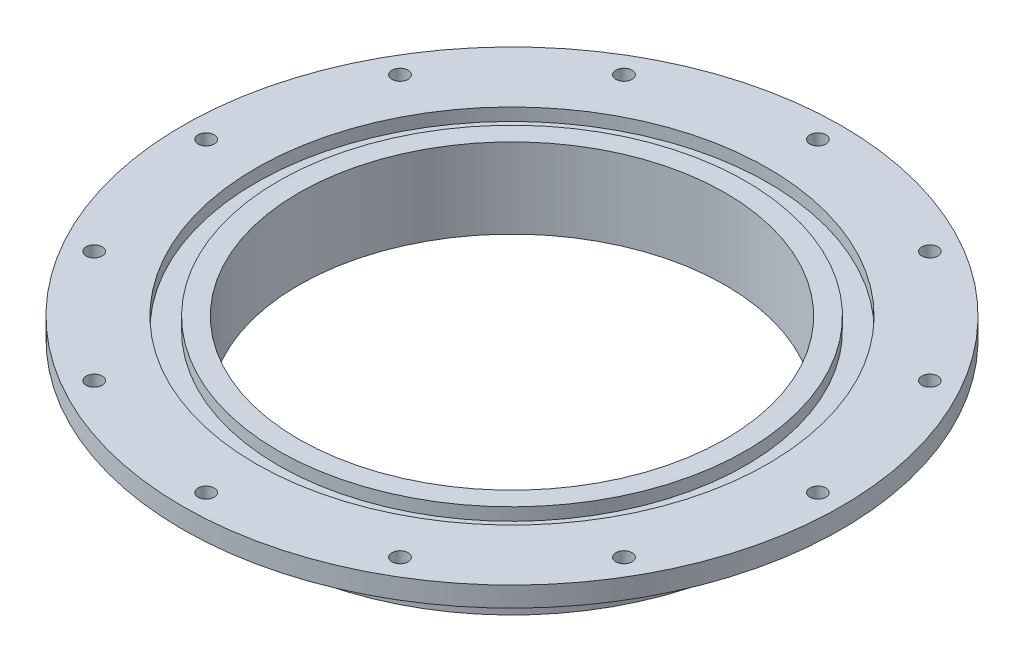
ISO-10303-21;
HEADER;
FILE_DESCRIPTION(('STEP AP214'),'2;1');
FILE_NAME('part.step','',(''),(''),'','','');
FILE_SCHEMA(('AUTOMOTIVE_DESIGN { 1 0 10303 214 1 1 1 1 }'));
ENDSEC;
DATA;
#1=APPLICATION_CONTEXT('core data for automotive mechanical design processes');
#2=APPLICATION_PROTOCOL_DEFINITION('international standard','automotive_design',2000,#1);
#3=PRODUCT_CONTEXT('',#1,'mechanical');
#4=PRODUCT('Part','Part','',(#3));
#5=PRODUCT_RELATED_PRODUCT_CATEGORY('part','',(#4));
#6=PRODUCT_DEFINITION_FORMATION('','',#4);
#7=PRODUCT_DEFINITION_CONTEXT('part definition',#1,'design');
#8=PRODUCT_DEFINITION('design','',#6,#7);
#9=PRODUCT_DEFINITION_SHAPE('','',#8);
#10=(LENGTH_UNIT() NAMED_UNIT(*) SI_UNIT(.MILLI.,.METRE.));
#11=(NAMED_UNIT(*) PLANE_ANGLE_UNIT() SI_UNIT($,.RADIAN.));
#12=(NAMED_UNIT(*) SI_UNIT($,.STERADIAN.) SOLID_ANGLE_UNIT());
#13=UNCERTAINTY_MEASURE_WITH_UNIT(LENGTH_MEASURE(1.E-05),#10,'distance_accuracy_value','');
#14=(GEOMETRIC_REPRESENTATION_CONTEXT(3) GLOBAL_UNCERTAINTY_ASSIGNED_CONTEXT((#13)) GLOBAL_UNIT_ASSIGNED_CONTEXT((#10,
#11,#12)) REPRESENTATION_CONTEXT('',''));
#15=CARTESIAN_POINT('',(0.,0.,0.));
#16=DIRECTION('',(0.,0.,1.));
#17=DIRECTION('',(1.,0.,0.));
#18=AXIS2_PLACEMENT_3D('',#15,#16,#17);
#19=CARTESIAN_POINT('',(0.,25.4,0.));
#20=DIRECTION('',(0.,1.,0.));
#21=DIRECTION('',(0.,0.,1.));
#22=AXIS2_PLACEMENT_3D('',#19,#20,#21);
#23=PLANE('',#22);
#24=CARTESIAN_POINT('',(0.,25.4,0.));
#25=DIRECTION('',(0.,1.,0.));
#26=DIRECTION('',(0.,0.,1.));
#27=AXIS2_PLACEMENT_3D('',#24,#25,#26);
#28=CIRCLE('',#27,67.818);
#29=CARTESIAN_POINT('',(0.,25.4,-67.818));
#30=VERTEX_POINT('',#29);
#31=EDGE_CURVE('E78',#30,#30,#28,.T.);
#32=ORIENTED_EDGE('',*,*,#31,.F.);
#33=EDGE_LOOP('',(#32));
#34=FACE_BOUND('',#33,.T.);
#35=CARTESIAN_POINT('',(0.,25.4,0.));
#36=DIRECTION('',(0.,1.,0.));
#37=DIRECTION('',(0.,0.,1.));
#38=AXIS2_PLACEMENT_3D('',#35,#36,#37);
#39=CIRCLE('',#38,74.295);
#40=CARTESIAN_POINT('',(0.,25.4,74.295));
#41=VERTEX_POINT('',#40);
#42=EDGE_CURVE('E99',#41,#41,#39,.T.);
#43=ORIENTED_EDGE('',*,*,#42,.T.);
#44=EDGE_LOOP('',(#43));
#45=FACE_BOUND('',#44,.T.);
#46=ADVANCED_FACE('F48',(#34,#45),#23,.T.);
#47=CARTESIAN_POINT('',(0.,0.,0.));
#48=DIRECTION('',(0.,1.,0.));
#49=DIRECTION('',(0.,0.,1.));
#50=AXIS2_PLACEMENT_3D('',#47,#48,#49);
#51=PLANE('',#50);
#52=CARTESIAN_POINT('',(0.,0.,0.));
#53=DIRECTION('',(0.,1.,0.));
#54=DIRECTION('',(0.,0.,1.));
#55=AXIS2_PLACEMENT_3D('',#52,#53,#54);
#56=CIRCLE('',#55,80.518);
#57=CARTESIAN_POINT('',(0.,0.,-80.518));
#58=VERTEX_POINT('',#57);
#59=EDGE_CURVE('E52',#58,#58,#56,.T.);
#60=ORIENTED_EDGE('',*,*,#59,.F.);
#61=EDGE_LOOP('',(#60));
#62=FACE_BOUND('',#61,.T.);
#63=CARTESIAN_POINT('',(0.,0.,0.));
#64=DIRECTION('',(0.,1.,0.));
#65=DIRECTION('',(0.,0.,1.));
#66=AXIS2_PLACEMENT_3D('',#63,#64,#65);
#67=CIRCLE('',#66,67.818);
#68=CARTESIAN_POINT('',(0.,0.,-67.818));
#69=VERTEX_POINT('',#68);
#70=EDGE_CURVE('E63',#69,#69,#67,.T.);
#71=ORIENTED_EDGE('',*,*,#70,.T.);
#72=EDGE_LOOP('',(#71));
#73=FACE_BOUND('',#72,.T.);
#74=ADVANCED_FACE('F223',(#62,#73),#51,.F.);
#75=CARTESIAN_POINT('',(0.,19.05,0.));
#76=DIRECTION('',(0.,-1.,0.));
#77=DIRECTION('',(0.,0.,-1.));
#78=AXIS2_PLACEMENT_3D('',#75,#76,#77);
#79=CYLINDRICAL_SURFACE('',#78,80.518);
#80=CARTESIAN_POINT('',(0.,19.05,0.));
#81=DIRECTION('',(0.,1.,0.));
#82=DIRECTION('',(0.,0.,1.));
#83=AXIS2_PLACEMENT_3D('',#80,#81,#82);
#84=CIRCLE('',#83,80.518);
#85=CARTESIAN_POINT('',(0.,19.05,-80.518));
#86=VERTEX_POINT('',#85);
#87=EDGE_CURVE('E11',#86,#86,#84,.T.);
#88=CARTESIAN_POINT('',(0.,19.05,-80.518));
#89=CARTESIAN_POINT('',(0.,18.8515625,-80.518));
#90=CARTESIAN_POINT('',(0.,18.653125,-80.518));
#91=CARTESIAN_POINT('',(0.,18.25625,-80.518));
#92=CARTESIAN_POINT('',(0.,18.0578125,-80.518));
#93=CARTESIAN_POINT('',(0.,17.6609375,-80.518));
#94=CARTESIAN_POINT('',(0.,17.4625,-80.518));
#95=CARTESIAN_POINT('',(0.,17.065625,-80.518));
#96=CARTESIAN_POINT('',(0.,16.8671875,-80.518));
#97=CARTESIAN_POINT('',(0.,16.4703125,-80.518));
#98=CARTESIAN_POINT('',(0.,16.271875,-80.518));
#99=CARTESIAN_POINT('',(0.,15.875,-80.518));
#100=CARTESIAN_POINT('',(0.,15.6765625,-80.518));
#101=CARTESIAN_POINT('',(0.,15.2796875,-80.518));
#102=CARTESIAN_POINT('',(0.,15.08125,-80.518));
#103=CARTESIAN_POINT('',(0.,14.684375,-80.518));
#104=CARTESIAN_POINT('',(0.,14.4859375,-80.518));
#105=CARTESIAN_POINT('',(0.,14.0890625,-80.518));
#106=CARTESIAN_POINT('',(0.,13.890625,-80.518));
#107=CARTESIAN_POINT('',(0.,13.49375,-80.518));
#108=CARTESIAN_POINT('',(0.,13.2953125,-80.518));
#109=CARTESIAN_POINT('',(0.,12.8984375,-80.518));
#110=CARTESIAN_POINT('',(0.,12.7,-80.518));
#111=CARTESIAN_POINT('',(0.,12.303125,-80.518));
#112=CARTESIAN_POINT('',(0.,12.1046875,-80.518));
#113=CARTESIAN_POINT('',(0.,11.7078125,-80.518));
#114=CARTESIAN_POINT('',(0.,11.509375,-80.518));
#115=CARTESIAN_POINT('',(0.,11.1125,-80.518));
#116=CARTESIAN_POINT('',(0.,10.9140625,-80.518));
#117=CARTESIAN_POINT('',(0.,10.5171875,-80.518));
#118=CARTESIAN_POINT('',(0.,10.31875,-80.518));
#119=CARTESIAN_POINT('',(0.,9.921875,-80.518));
#120=CARTESIAN_POINT('',(0.,9.7234375,-80.518));
#121=CARTESIAN_POINT('',(0.,9.3265625,-80.518));
#122=CARTESIAN_POINT('',(0.,9.128125,-80.518));
#123=CARTESIAN_POINT('',(0.,8.73125,-80.518));
#124=CARTESIAN_POINT('',(0.,8.5328125,-80.518));
#125=CARTESIAN_POINT('',(0.,8.1359375,-80.518));
#126=CARTESIAN_POINT('',(0.,7.9375,-80.518));
#127=CARTESIAN_POINT('',(0.,7.540625,-80.518));
#128=CARTESIAN_POINT('',(0.,7.3421875,-80.518));
#129=CARTESIAN_POINT('',(0.,6.9453125,-80.518));
#130=CARTESIAN_POINT('',(0.,6.746875,-80.518));
#131=CARTESIAN_POINT('',(0.,6.35,-80.518));
#132=CARTESIAN_POINT('',(0.,6.1515625,-80.518));
#133=CARTESIAN_POINT('',(0.,5.7546875,-80.518));
#134=CARTESIAN_POINT('',(0.,5.55625,-80.518));
#135=CARTESIAN_POINT('',(0.,5.159375,-80.518));
#136=CARTESIAN_POINT('',(0.,4.9609375,-80.518));
#137=CARTESIAN_POINT('',(0.,4.5640625,-80.518));
#138=CARTESIAN_POINT('',(0.,4.365625,-80.518));
#139=CARTESIAN_POINT('',(0.,3.96875,-80.518));
#140=CARTESIAN_POINT('',(0.,3.7703125,-80.518));
#141=CARTESIAN_POINT('',(0.,3.3734375,-80.518));
#142=CARTESIAN_POINT('',(0.,3.175,-80.518));
#143=CARTESIAN_POINT('',(0.,2.778125,-80.518));
#144=CARTESIAN_POINT('',(0.,2.5796875,-80.518));
#145=CARTESIAN_POINT('',(0.,2.1828125,-80.518));
#146=CARTESIAN_POINT('',(0.,1.984375,-80.518));
#147=CARTESIAN_POINT('',(0.,1.5875,-80.518));
#148=CARTESIAN_POINT('',(0.,1.3890625,-80.518));
#149=CARTESIAN_POINT('',(0.,0.992187500000001,-80.518));
#150=CARTESIAN_POINT('',(0.,0.793750000000001,-80.518));
#151=CARTESIAN_POINT('',(0.,0.396875,-80.518));
#152=CARTESIAN_POINT('',(0.,0.1984375,-80.518));
#153=CARTESIAN_POINT('',(0.,0.,-80.518));
#154=B_SPLINE_CURVE_WITH_KNOTS('',3,(#88,#89,#90,#91,#92,#93,#94,#95,#96,#97,#98,#99,#100,#101,
#102,#103,#104,#105,#106,#107,#108,#109,#110,#111,#112,#113,#114,#115,#116,#117,#118,#119,#120,
#121,#122,#123,#124,#125,#126,#127,#128,#129,#130,#131,#132,#133,#134,#135,#136,#137,#138,#139,
#140,#141,#142,#143,#144,#145,#146,#147,#148,#149,#150,#151,#152,#153),.UNSPECIFIED.,.F.,.F.,(4,
2,2,2,2,2,2,2,2,2,2,2,2,2,2,2,2,2,2,2,2,2,2,2,2,2,2,2,2,2,2,2,4),(0.,0.595312499999997,1.190625,
1.7859375,2.38125,2.9765625,3.571875,4.1671875,4.7625,5.3578125,5.953125,6.5484375,7.14375,
7.7390625,8.334375,8.9296875,9.525,10.1203125,10.715625,11.3109375,11.90625,12.5015625,
13.096875,13.6921875,14.2875,14.8828125,15.478125,16.0734375,16.66875,17.2640625,17.859375,
18.4546875,19.05),.UNSPECIFIED.);
#155=EDGE_CURVE('BSEAM50',#86,#58,#154,.T.);
#156=ORIENTED_EDGE('',*,*,#87,.F.);
#157=ORIENTED_EDGE('',*,*,#59,.T.);
#158=ORIENTED_EDGE('',*,*,#155,.T.);
#159=ORIENTED_EDGE('',*,*,#155,.F.);
#160=EDGE_LOOP('',(#156,#158,#157,#159));
#161=FACE_BOUND('',#160,.T.);
#162=ADVANCED_FACE('F50',(#161),#79,.T.);
#163=CARTESIAN_POINT('',(0.,19.05,0.));
#164=DIRECTION('',(0.,-1.,0.));
#165=DIRECTION('',(0.,0.,-1.));
#166=AXIS2_PLACEMENT_3D('',#163,#164,#165);
#167=CYLINDRICAL_SURFACE('',#166,67.818);
#168=CARTESIAN_POINT('',(0.,0.,-67.818));
#169=CARTESIAN_POINT('',(0.,0.264583333333333,-67.818));
#170=CARTESIAN_POINT('',(0.,0.529166666666666,-67.818));
#171=CARTESIAN_POINT('',(0.,1.05833333333333,-67.818));
#172=CARTESIAN_POINT('',(0.,1.32291666666667,-67.818));
#173=CARTESIAN_POINT('',(0.,1.85208333333333,-67.818));
#174=CARTESIAN_POINT('',(0.,2.11666666666667,-67.818));
#175=CARTESIAN_POINT('',(0.,2.64583333333333,-67.818));
#176=CARTESIAN_POINT('',(0.,2.91041666666667,-67.818));
#177=CARTESIAN_POINT('',(0.,3.43958333333333,-67.818));
#178=CARTESIAN_POINT('',(0.,3.70416666666667,-67.818));
#179=CARTESIAN_POINT('',(0.,4.23333333333333,-67.818));
#180=CARTESIAN_POINT('',(0.,4.49791666666667,-67.818));
#181=CARTESIAN_POINT('',(0.,5.02708333333333,-67.818));
#182=CARTESIAN_POINT('',(0.,5.29166666666666,-67.818));
#183=CARTESIAN_POINT('',(0.,5.82083333333333,-67.818));
#184=CARTESIAN_POINT('',(0.,6.08541666666666,-67.818));
#185=CARTESIAN_POINT('',(0.,6.61458333333333,-67.818));
#186=CARTESIAN_POINT('',(0.,6.87916666666667,-67.818));
#187=CARTESIAN_POINT('',(0.,7.40833333333333,-67.818));
#188=CARTESIAN_POINT('',(0.,7.67291666666667,-67.818));
#189=CARTESIAN_POINT('',(0.,8.20208333333333,-67.818));
#190=CARTESIAN_POINT('',(0.,8.46666666666666,-67.818));
#191=CARTESIAN_POINT('',(0.,8.99583333333333,-67.818));
#192=CARTESIAN_POINT('',(0.,9.26041666666666,-67.818));
#193=CARTESIAN_POINT('',(0.,9.78958333333333,-67.818));
#194=CARTESIAN_POINT('',(0.,10.0541666666667,-67.818));
#195=CARTESIAN_POINT('',(0.,10.5833333333333,-67.818));
#196=CARTESIAN_POINT('',(0.,10.8479166666667,-67.818));
#197=CARTESIAN_POINT('',(0.,11.3770833333333,-67.818));
#198=CARTESIAN_POINT('',(0.,11.6416666666667,-67.818));
#199=CARTESIAN_POINT('',(0.,12.1708333333333,-67.818));
#200=CARTESIAN_POINT('',(0.,12.4354166666667,-67.818));
#201=CARTESIAN_POINT('',(0.,12.9645833333333,-67.818));
#202=CARTESIAN_POINT('',(0.,13.2291666666667,-67.818));
#203=CARTESIAN_POINT('',(0.,13.7583333333333,-67.818));
#204=CARTESIAN_POINT('',(0.,14.0229166666667,-67.818));
#205=CARTESIAN_POINT('',(0.,14.5520833333333,-67.818));
#206=CARTESIAN_POINT('',(0.,14.8166666666667,-67.818));
#207=CARTESIAN_POINT('',(0.,15.3458333333333,-67.818));
#208=CARTESIAN_POINT('',(0.,15.6104166666667,-67.818));
#209=CARTESIAN_POINT('',(0.,16.1395833333333,-67.818));
#210=CARTESIAN_POINT('',(0.,16.4041666666667,-67.818));
#211=CARTESIAN_POINT('',(0.,16.9333333333333,-67.818));
#212=CARTESIAN_POINT('',(0.,17.1979166666667,-67.818));
#213=CARTESIAN_POINT('',(0.,17.7270833333333,-67.818));
#214=CARTESIAN_POINT('',(0.,17.9916666666667,-67.818));
#215=CARTESIAN_POINT('',(0.,18.5208333333333,-67.818));
#216=CARTESIAN_POINT('',(0.,18.7854166666667,-67.818));
#217=CARTESIAN_POINT('',(0.,19.3145833333333,-67.818));
#218=CARTESIAN_POINT('',(0.,19.5791666666667,-67.818));
#219=CARTESIAN_POINT('',(0.,20.1083333333333,-67.818));
#220=CARTESIAN_POINT('',(0.,20.3729166666667,-67.818));
#221=CARTESIAN_POINT('',(0.,20.9020833333333,-67.818));
#222=CARTESIAN_POINT('',(0.,21.1666666666667,-67.818));
#223=CARTESIAN_POINT('',(0.,21.6958333333333,-67.818));
#224=CARTESIAN_POINT('',(0.,21.9604166666667,-67.818));
#225=CARTESIAN_POINT('',(0.,22.4895833333333,-67.818));
#226=CARTESIAN_POINT('',(0.,22.7541666666667,-67.818));
#227=CARTESIAN_POINT('',(0.,23.2833333333333,-67.818));
#228=CARTESIAN_POINT('',(0.,23.5479166666667,-67.818));
#229=CARTESIAN_POINT('',(0.,24.0770833333333,-67.818));
#230=CARTESIAN_POINT('',(0.,24.3416666666667,-67.818));
#231=CARTESIAN_POINT('',(0.,24.8708333333333,-67.818));
#232=CARTESIAN_POINT('',(0.,25.1354166666667,-67.818));
#233=CARTESIAN_POINT('',(0.,25.4,-67.818));
#234=B_SPLINE_CURVE_WITH_KNOTS('',3,(#168,#169,#170,#171,#172,#173,#174,#175,#176,#177,#178,
#179,#180,#181,#182,#183,#184,#185,#186,#187,#188,#189,#190,#191,#192,#193,#194,#195,#196,#197,
#198,#199,#200,#201,#202,#203,#204,#205,#206,#207,#208,#209,#210,#211,#212,#213,#214,#215,#216,
#217,#218,#219,#220,#221,#222,#223,#224,#225,#226,#227,#228,#229,#230,#231,#232,#233),
.UNSPECIFIED.,.F.,.F.,(4,2,2,2,2,2,2,2,2,2,2,2,2,2,2,2,2,2,2,2,2,2,2,2,2,2,2,2,2,2,2,2,4),(0.,
0.793749999999999,1.5875,2.38125,3.175,3.96875,4.7625,5.55625,6.35,7.14375,7.9375,8.73125,9.525,
10.31875,11.1125,11.90625,12.7,13.49375,14.2875,15.08125,15.875,16.66875,17.4625,18.25625,19.05,
19.84375,20.6375,21.43125,22.225,23.01875,23.8125,24.60625,25.4),.UNSPECIFIED.);
#235=EDGE_CURVE('BSEAM195',#69,#30,#234,.T.);
#236=ORIENTED_EDGE('',*,*,#70,.F.);
#237=ORIENTED_EDGE('',*,*,#31,.T.);
#238=ORIENTED_EDGE('',*,*,#235,.T.);
#239=ORIENTED_EDGE('',*,*,#235,.F.);
#240=EDGE_LOOP('',(#236,#238,#237,#239));
#241=FACE_BOUND('',#240,.T.);
#242=ADVANCED_FACE('F195',(#241),#167,.F.);
#243=CARTESIAN_POINT('',(84.2211870243877,25.4,48.6251249999998));
#244=DIRECTION('',(0.,1.,0.));
#245=DIRECTION('',(0.86602540378444,0.,0.499999999999998));
#246=AXIS2_PLACEMENT_3D('',#243,#244,#245);
#247=CIRCLE('',#246,2.55269999999999);
#248=CARTESIAN_POINT('',(86.4318900726283,25.4,49.9014749999998));
#249=VERTEX_POINT('',#248);
#250=EDGE_CURVE('E167',#249,#249,#247,.T.);
#251=ORIENTED_EDGE('',*,*,#250,.F.);
#252=EDGE_LOOP('',(#251));
#253=FACE_BOUND('',#252,.T.);
#254=CARTESIAN_POINT('',(97.25025,25.4,-3.39547433072829E-13));
#255=DIRECTION('',(0.,1.,0.));
#256=DIRECTION('',(1.,0.,0.));
#257=AXIS2_PLACEMENT_3D('',#254,#255,#256);
#258=CIRCLE('',#257,2.55269999999999);
#259=CARTESIAN_POINT('',(99.80295,25.4,-3.48460137486494E-13));
#260=VERTEX_POINT('',#259);
#261=EDGE_CURVE('E160',#260,#260,#258,.T.);
#262=ORIENTED_EDGE('',*,*,#261,.F.);
#263=EDGE_LOOP('',(#262));
#264=FACE_BOUND('',#263,.T.);
#265=CARTESIAN_POINT('',(84.2211870243874,25.4,-48.6251250000004));
#266=DIRECTION('',(0.,1.,0.));
#267=DIRECTION('',(0.866025403784436,0.,-0.500000000000004));
#268=AXIS2_PLACEMENT_3D('',#265,#266,#267);
#269=CIRCLE('',#268,2.55269999999999);
#270=CARTESIAN_POINT('',(86.4318900726279,25.4,-49.9014750000004));
#271=VERTEX_POINT('',#270);
#272=EDGE_CURVE('E153',#271,#271,#269,.T.);
#273=ORIENTED_EDGE('',*,*,#272,.F.);
#274=EDGE_LOOP('',(#273));
#275=FACE_BOUND('',#274,.T.);
#276=CARTESIAN_POINT('',(48.6251249999995,25.4,-84.2211870243879));
#277=DIRECTION('',(0.,1.,0.));
#278=DIRECTION('',(0.499999999999995,0.,-0.866025403784442));
#279=AXIS2_PLACEMENT_3D('',#276,#277,#278);
#280=CIRCLE('',#279,2.55269999999999);
#281=CARTESIAN_POINT('',(49.9014749999995,25.4,-86.4318900726284));
#282=VERTEX_POINT('',#281);
#283=EDGE_CURVE('E146',#282,#282,#280,.T.);
#284=ORIENTED_EDGE('',*,*,#283,.F.);
#285=EDGE_LOOP('',(#284));
#286=FACE_BOUND('',#285,.T.);
#287=CARTESIAN_POINT('',(0.,25.4,-97.25025));
#288=DIRECTION('',(0.,1.,0.));
#289=DIRECTION('',(0.,0.,-1.));
#290=AXIS2_PLACEMENT_3D('',#287,#288,#289);
#291=CIRCLE('',#290,2.55269999999999);
#292=CARTESIAN_POINT('',(0.,25.4,-99.80295));
#293=VERTEX_POINT('',#292);
#294=EDGE_CURVE('E139',#293,#293,#291,.T.);
#295=ORIENTED_EDGE('',*,*,#294,.F.);
#296=EDGE_LOOP('',(#295));
#297=FACE_BOUND('',#296,.T.);
#298=CARTESIAN_POINT('',(-48.6251250000007,25.4,-84.2211870243872));
#299=DIRECTION('',(0.,1.,0.));
#300=DIRECTION('',(-0.500000000000007,0.,-0.866025403784435));
#301=AXIS2_PLACEMENT_3D('',#298,#299,#300);
#302=CIRCLE('',#301,2.55269999999999);
#303=CARTESIAN_POINT('',(-49.9014750000007,25.4,-86.4318900726277));
#304=VERTEX_POINT('',#303);
#305=EDGE_CURVE('E132',#304,#304,#302,.T.);
#306=ORIENTED_EDGE('',*,*,#305,.F.);
#307=EDGE_LOOP('',(#306));
#308=FACE_BOUND('',#307,.T.);
#309=CARTESIAN_POINT('',(-84.2211870243881,25.4,-48.6251249999992));
#310=DIRECTION('',(0.,1.,0.));
#311=DIRECTION('',(-0.866025403784443,0.,-0.499999999999992));
#312=AXIS2_PLACEMENT_3D('',#309,#310,#311);
#313=CIRCLE('',#312,2.55269999999999);
#314=CARTESIAN_POINT('',(-86.4318900726286,25.4,-49.9014749999992));
#315=VERTEX_POINT('',#314);
#316=EDGE_CURVE('E123',#315,#315,#313,.T.);
#317=ORIENTED_EDGE('',*,*,#316,.F.);
#318=EDGE_LOOP('',(#317));
#319=FACE_BOUND('',#318,.T.);
#320=CARTESIAN_POINT('',(-97.25025,25.4,1.01864229921849E-12));
#321=DIRECTION('',(0.,1.,0.));
#322=DIRECTION('',(-1.,0.,0.));
#323=AXIS2_PLACEMENT_3D('',#320,#321,#322);
#324=CIRCLE('',#323,2.55269999999999);
#325=CARTESIAN_POINT('',(-99.80295,25.4,1.04538041245948E-12));
#326=VERTEX_POINT('',#325);
#327=EDGE_CURVE('E124',#326,#326,#324,.T.);
#328=ORIENTED_EDGE('',*,*,#327,.F.);
#329=EDGE_LOOP('',(#328));
#330=FACE_BOUND('',#329,.T.);
#331=CARTESIAN_POINT('',(-84.221187024387,25.4,48.625125000001));
#332=DIRECTION('',(0.,1.,0.));
#333=DIRECTION('',(-0.866025403784433,0.,0.50000000000001));
#334=AXIS2_PLACEMENT_3D('',#331,#332,#333);
#335=CIRCLE('',#334,2.55269999999999);
#336=CARTESIAN_POINT('',(-86.4318900726276,25.4,49.901475000001));
#337=VERTEX_POINT('',#336);
#338=EDGE_CURVE('E179',#337,#337,#335,.T.);
#339=ORIENTED_EDGE('',*,*,#338,.F.);
#340=EDGE_LOOP('',(#339));
#341=FACE_BOUND('',#340,.T.);
#342=CARTESIAN_POINT('',(-48.6251249999989,25.4,84.2211870243882));
#343=DIRECTION('',(0.,1.,0.));
#344=DIRECTION('',(-0.499999999999989,0.,0.866025403784445));
#345=AXIS2_PLACEMENT_3D('',#342,#343,#344);
#346=CIRCLE('',#345,2.55269999999999);
#347=CARTESIAN_POINT('',(-49.9014749999989,25.4,86.4318900726288));
#348=VERTEX_POINT('',#347);
#349=EDGE_CURVE('E180',#348,#348,#346,.T.);
#350=ORIENTED_EDGE('',*,*,#349,.F.);
#351=EDGE_LOOP('',(#350));
#352=FACE_BOUND('',#351,.T.);
#353=CARTESIAN_POINT('',(48.6251250000001,25.4,84.2211870243875));
#354=DIRECTION('',(0.,1.,0.));
#355=DIRECTION('',(0.500000000000001,0.,0.866025403784438));
#356=AXIS2_PLACEMENT_3D('',#353,#354,#355);
#357=CIRCLE('',#356,2.55269999999999);
#358=CARTESIAN_POINT('',(49.9014750000001,25.4,86.4318900726281));
#359=VERTEX_POINT('',#358);
#360=EDGE_CURVE('E115',#359,#359,#357,.T.);
#361=ORIENTED_EDGE('',*,*,#360,.F.);
#362=EDGE_LOOP('',(#361));
#363=FACE_BOUND('',#362,.T.);
#364=CARTESIAN_POINT('',(0.,25.4,97.25025));
#365=DIRECTION('',(0.,1.,0.));
#366=DIRECTION('',(0.,0.,1.));
#367=AXIS2_PLACEMENT_3D('',#364,#365,#366);
#368=CIRCLE('',#367,2.55269999999999);
#369=CARTESIAN_POINT('',(0.,25.4,99.80295));
#370=VERTEX_POINT('',#369);
#371=EDGE_CURVE('E108',#370,#370,#368,.T.);
#372=ORIENTED_EDGE('',*,*,#371,.F.);
#373=EDGE_LOOP('',(#372));
#374=FACE_BOUND('',#373,.T.);
#375=CARTESIAN_POINT('',(0.,25.4,0.));
#376=DIRECTION('',(0.,1.,0.));
#377=DIRECTION('',(0.,0.,1.));
#378=AXIS2_PLACEMENT_3D('',#375,#376,#377);
#379=CIRCLE('',#378,81.407);
#380=CARTESIAN_POINT('',(0.,25.4,81.407));
#381=VERTEX_POINT('',#380);
#382=EDGE_CURVE('E93',#381,#381,#379,.T.);
#383=ORIENTED_EDGE('',*,*,#382,.F.);
#384=EDGE_LOOP('',(#383));
#385=FACE_BOUND('',#384,.T.);
#386=CARTESIAN_POINT('',(0.,25.4,0.));
#387=DIRECTION('',(0.,1.,0.));
#388=DIRECTION('',(0.,0.,1.));
#389=AXIS2_PLACEMENT_3D('',#386,#387,#388);
#390=CIRCLE('',#389,104.775);
#391=CARTESIAN_POINT('',(0.,25.4,104.775));
#392=VERTEX_POINT('',#391);
#393=EDGE_CURVE('E77',#392,#392,#390,.T.);
#394=ORIENTED_EDGE('',*,*,#393,.T.);
#395=EDGE_LOOP('',(#394));
#396=FACE_BOUND('',#395,.T.);
#397=ADVANCED_FACE('F191',(#253,#264,#275,#286,#297,#308,#319,#330,#341,#352,#363,#374,#385,
#396),#23,.T.);
#398=CARTESIAN_POINT('',(0.,19.05,0.));
#399=DIRECTION('',(0.,1.,0.));
#400=DIRECTION('',(0.,0.,1.));
#401=AXIS2_PLACEMENT_3D('',#398,#399,#400);
#402=PLANE('',#401);
#403=CARTESIAN_POINT('',(84.2211870243877,19.05,48.6251249999998));
#404=DIRECTION('',(0.,1.,0.));
#405=DIRECTION('',(0.,0.,1.));
#406=AXIS2_PLACEMENT_3D('',#403,#404,#405);
#407=CIRCLE('',#406,2.55269999999999);
#408=CARTESIAN_POINT('',(84.2211870243877,19.05,51.1778249999998));
#409=VERTEX_POINT('',#408);
#410=EDGE_CURVE('E118',#409,#409,#407,.F.);
#411=ORIENTED_EDGE('',*,*,#410,.F.);
#412=EDGE_LOOP('',(#411));
#413=FACE_BOUND('',#412,.T.);
#414=CARTESIAN_POINT('',(97.25025,19.05,-3.39547433072829E-13));
#415=DIRECTION('',(0.,1.,0.));
#416=DIRECTION('',(0.,0.,1.));
#417=AXIS2_PLACEMENT_3D('',#414,#415,#416);
#418=CIRCLE('',#417,2.55269999999999);
#419=CARTESIAN_POINT('',(97.25025,19.05,2.55269999999965));
#420=VERTEX_POINT('',#419);
#421=EDGE_CURVE('E163',#420,#420,#418,.F.);
#422=ORIENTED_EDGE('',*,*,#421,.F.);
#423=EDGE_LOOP('',(#422));
#424=FACE_BOUND('',#423,.T.);
#425=CARTESIAN_POINT('',(84.2211870243874,19.05,-48.6251250000004));
#426=DIRECTION('',(0.,1.,0.));
#427=DIRECTION('',(0.,0.,1.));
#428=AXIS2_PLACEMENT_3D('',#425,#426,#427);
#429=CIRCLE('',#428,2.55269999999999);
#430=CARTESIAN_POINT('',(84.2211870243874,19.05,-46.0724250000004));
#431=VERTEX_POINT('',#430);
#432=EDGE_CURVE('E156',#431,#431,#429,.F.);
#433=ORIENTED_EDGE('',*,*,#432,.F.);
#434=EDGE_LOOP('',(#433));
#435=FACE_BOUND('',#434,.T.);
#436=CARTESIAN_POINT('',(48.6251249999995,19.05,-84.2211870243879));
#437=DIRECTION('',(0.,1.,0.));
#438=DIRECTION('',(0.,0.,1.));
#439=AXIS2_PLACEMENT_3D('',#436,#437,#438);
#440=CIRCLE('',#439,2.55269999999999);
#441=CARTESIAN_POINT('',(48.6251249999995,19.05,-81.6684870243879));
#442=VERTEX_POINT('',#441);
#443=EDGE_CURVE('E149',#442,#442,#440,.F.);
#444=ORIENTED_EDGE('',*,*,#443,.F.);
#445=EDGE_LOOP('',(#444));
#446=FACE_BOUND('',#445,.T.);
#447=CARTESIAN_POINT('',(0.,19.05,-97.25025));
#448=DIRECTION('',(0.,1.,0.));
#449=DIRECTION('',(0.,0.,1.));
#450=AXIS2_PLACEMENT_3D('',#447,#448,#449);
#451=CIRCLE('',#450,2.55269999999999);
#452=CARTESIAN_POINT('',(0.,19.05,-94.69755));
#453=VERTEX_POINT('',#452);
#454=EDGE_CURVE('E142',#453,#453,#451,.F.);
#455=ORIENTED_EDGE('',*,*,#454,.F.);
#456=EDGE_LOOP('',(#455));
#457=FACE_BOUND('',#456,.T.);
#458=CARTESIAN_POINT('',(-48.6251250000007,19.05,-84.2211870243872));
#459=DIRECTION('',(0.,1.,0.));
#460=DIRECTION('',(0.,0.,1.));
#461=AXIS2_PLACEMENT_3D('',#458,#459,#460);
#462=CIRCLE('',#461,2.55269999999999);
#463=CARTESIAN_POINT('',(-48.6251250000007,19.05,-81.6684870243872));
#464=VERTEX_POINT('',#463);
#465=EDGE_CURVE('E135',#464,#464,#462,.F.);
#466=ORIENTED_EDGE('',*,*,#465,.F.);
#467=EDGE_LOOP('',(#466));
#468=FACE_BOUND('',#467,.T.);
#469=CARTESIAN_POINT('',(-84.2211870243881,19.05,-48.6251249999992));
#470=DIRECTION('',(0.,1.,0.));
#471=DIRECTION('',(0.,0.,1.));
#472=AXIS2_PLACEMENT_3D('',#469,#470,#471);
#473=CIRCLE('',#472,2.55269999999999);
#474=CARTESIAN_POINT('',(-84.2211870243881,19.05,-46.0724249999992));
#475=VERTEX_POINT('',#474);
#476=EDGE_CURVE('E128',#475,#475,#473,.F.);
#477=ORIENTED_EDGE('',*,*,#476,.F.);
#478=EDGE_LOOP('',(#477));
#479=FACE_BOUND('',#478,.T.);
#480=CARTESIAN_POINT('',(-97.25025,19.05,1.01864229921849E-12));
#481=DIRECTION('',(0.,1.,0.));
#482=DIRECTION('',(0.,0.,1.));
#483=AXIS2_PLACEMENT_3D('',#480,#481,#482);
#484=CIRCLE('',#483,2.55269999999999);
#485=CARTESIAN_POINT('',(-97.25025,19.05,2.55270000000101));
#486=VERTEX_POINT('',#485);
#487=EDGE_CURVE('E119',#486,#486,#484,.F.);
#488=ORIENTED_EDGE('',*,*,#487,.F.);
#489=EDGE_LOOP('',(#488));
#490=FACE_BOUND('',#489,.T.);
#491=CARTESIAN_POINT('',(-84.221187024387,19.05,48.625125000001));
#492=DIRECTION('',(0.,1.,0.));
#493=DIRECTION('',(0.,0.,1.));
#494=AXIS2_PLACEMENT_3D('',#491,#492,#493);
#495=CIRCLE('',#494,2.55269999999999);
#496=CARTESIAN_POINT('',(-84.221187024387,19.05,51.177825000001));
#497=VERTEX_POINT('',#496);
#498=EDGE_CURVE('E127',#497,#497,#495,.F.);
#499=ORIENTED_EDGE('',*,*,#498,.F.);
#500=EDGE_LOOP('',(#499));
#501=FACE_BOUND('',#500,.T.);
#502=CARTESIAN_POINT('',(-48.6251249999989,19.05,84.2211870243882));
#503=DIRECTION('',(0.,1.,0.));
#504=DIRECTION('',(0.,0.,1.));
#505=AXIS2_PLACEMENT_3D('',#502,#503,#504);
#506=CIRCLE('',#505,2.55269999999999);
#507=CARTESIAN_POINT('',(-48.6251249999989,19.05,86.7738870243882));
#508=VERTEX_POINT('',#507);
#509=EDGE_CURVE('E175',#508,#508,#506,.F.);
#510=ORIENTED_EDGE('',*,*,#509,.F.);
#511=EDGE_LOOP('',(#510));
#512=FACE_BOUND('',#511,.T.);
#513=CARTESIAN_POINT('',(48.6251250000001,19.05,84.2211870243875));
#514=DIRECTION('',(0.,1.,0.));
#515=DIRECTION('',(0.,0.,1.));
#516=AXIS2_PLACEMENT_3D('',#513,#514,#515);
#517=CIRCLE('',#516,2.55269999999999);
#518=CARTESIAN_POINT('',(48.6251250000001,19.05,86.7738870243875));
#519=VERTEX_POINT('',#518);
#520=EDGE_CURVE('E111',#519,#519,#517,.F.);
#521=ORIENTED_EDGE('',*,*,#520,.F.);
#522=EDGE_LOOP('',(#521));
#523=FACE_BOUND('',#522,.T.);
#524=CARTESIAN_POINT('',(0.,19.05,97.25025));
#525=DIRECTION('',(0.,1.,0.));
#526=DIRECTION('',(0.,0.,1.));
#527=AXIS2_PLACEMENT_3D('',#524,#525,#526);
#528=CIRCLE('',#527,2.55269999999999);
#529=CARTESIAN_POINT('',(0.,19.05,99.80295));
#530=VERTEX_POINT('',#529);
#531=EDGE_CURVE('E102',#530,#530,#528,.F.);
#532=ORIENTED_EDGE('',*,*,#531,.F.);
#533=EDGE_LOOP('',(#532));
#534=FACE_BOUND('',#533,.T.);
#535=ORIENTED_EDGE('',*,*,#87,.T.);
#536=EDGE_LOOP('',(#535));
#537=FACE_BOUND('',#536,.T.);
#538=CARTESIAN_POINT('',(0.,19.05,0.));
#539=DIRECTION('',(0.,1.,0.));
#540=DIRECTION('',(0.,0.,1.));
#541=AXIS2_PLACEMENT_3D('',#538,#539,#540);
#542=CIRCLE('',#541,104.775);
#543=CARTESIAN_POINT('',(0.,19.05,104.775));
#544=VERTEX_POINT('',#543);
#545=EDGE_CURVE('E74',#544,#544,#542,.T.);
#546=ORIENTED_EDGE('',*,*,#545,.F.);
#547=EDGE_LOOP('',(#546));
#548=FACE_BOUND('',#547,.T.);
#549=ADVANCED_FACE('F194',(#413,#424,#435,#446,#457,#468,#479,#490,#501,#512,#523,#534,#537,
#548),#402,.F.);
#550=CARTESIAN_POINT('',(0.,25.4,0.));
#551=DIRECTION('',(0.,-1.,0.));
#552=DIRECTION('',(0.,0.,-1.));
#553=AXIS2_PLACEMENT_3D('',#550,#551,#552);
#554=CYLINDRICAL_SURFACE('',#553,104.775);
#555=ORIENTED_EDGE('',*,*,#393,.F.);
#556=EDGE_LOOP('',(#555));
#557=FACE_BOUND('',#556,.T.);
#558=ORIENTED_EDGE('',*,*,#545,.T.);
#559=EDGE_LOOP('',(#558));
#560=FACE_BOUND('',#559,.T.);
#561=ADVANCED_FACE('F208',(#557,#560),#554,.T.);
#562=CARTESIAN_POINT('',(0.,21.4122,0.));
#563=DIRECTION('',(0.,1.,0.));
#564=DIRECTION('',(0.,0.,1.));
#565=AXIS2_PLACEMENT_3D('',#562,#563,#564);
#566=CYLINDRICAL_SURFACE('',#565,81.407);
#567=CARTESIAN_POINT('',(0.,21.4122,0.));
#568=DIRECTION('',(0.,1.,0.));
#569=DIRECTION('',(0.,0.,1.));
#570=AXIS2_PLACEMENT_3D('',#567,#568,#569);
#571=CIRCLE('',#570,81.407);
#572=CARTESIAN_POINT('',(0.,21.4122,81.407));
#573=VERTEX_POINT('',#572);
#574=EDGE_CURVE('E92',#573,#573,#571,.T.);
#575=ORIENTED_EDGE('',*,*,#574,.F.);
#576=EDGE_LOOP('',(#575));
#577=FACE_BOUND('',#576,.T.);
#578=ORIENTED_EDGE('',*,*,#382,.T.);
#579=EDGE_LOOP('',(#578));
#580=FACE_BOUND('',#579,.T.);
#581=ADVANCED_FACE('F211',(#577,#580),#566,.F.);
#582=CARTESIAN_POINT('',(0.,21.4122,0.));
#583=DIRECTION('',(0.,1.,0.));
#584=DIRECTION('',(0.,0.,1.));
#585=AXIS2_PLACEMENT_3D('',#582,#583,#584);
#586=PLANE('',#585);
#587=CARTESIAN_POINT('',(0.,21.4122,0.));
#588=DIRECTION('',(0.,1.,0.));
#589=DIRECTION('',(0.,0.,1.));
#590=AXIS2_PLACEMENT_3D('',#587,#588,#589);
#591=CIRCLE('',#590,74.295);
#592=CARTESIAN_POINT('',(0.,21.4122,74.295));
#593=VERTEX_POINT('',#592);
#594=EDGE_CURVE('E96',#593,#593,#591,.T.);
#595=ORIENTED_EDGE('',*,*,#594,.F.);
#596=EDGE_LOOP('',(#595));
#597=FACE_BOUND('',#596,.T.);
#598=ORIENTED_EDGE('',*,*,#574,.T.);
#599=EDGE_LOOP('',(#598));
#600=FACE_BOUND('',#599,.T.);
#601=ADVANCED_FACE('F234',(#597,#600),#586,.T.);
#602=CARTESIAN_POINT('',(0.,21.4122,0.));
#603=DIRECTION('',(0.,1.,0.));
#604=DIRECTION('',(0.,0.,1.));
#605=AXIS2_PLACEMENT_3D('',#602,#603,#604);
#606=CYLINDRICAL_SURFACE('',#605,74.295);
#607=ORIENTED_EDGE('',*,*,#594,.T.);
#608=EDGE_LOOP('',(#607));
#609=FACE_BOUND('',#608,.T.);
#610=ORIENTED_EDGE('',*,*,#42,.F.);
#611=EDGE_LOOP('',(#610));
#612=FACE_BOUND('',#611,.T.);
#613=ADVANCED_FACE('F238',(#609,#612),#606,.T.);
#614=CARTESIAN_POINT('',(0.,11.8298740786604,97.25025));
#615=DIRECTION('',(0.,1.,0.));
#616=DIRECTION('',(0.,0.,1.));
#617=AXIS2_PLACEMENT_3D('',#614,#615,#616);
#618=CYLINDRICAL_SURFACE('',#617,2.55269999999999);
#619=ORIENTED_EDGE('',*,*,#531,.T.);
#620=EDGE_LOOP('',(#619));
#621=FACE_BOUND('',#620,.T.);
#622=ORIENTED_EDGE('',*,*,#371,.T.);
#623=EDGE_LOOP('',(#622));
#624=FACE_BOUND('',#623,.T.);
#625=ADVANCED_FACE('F242',(#621,#624),#618,.F.);
#626=CARTESIAN_POINT('',(48.6251250000001,11.8298740786604,84.2211870243875));
#627=DIRECTION('',(0.,1.,0.));
#628=DIRECTION('',(0.,0.,1.));
#629=AXIS2_PLACEMENT_3D('',#626,#627,#628);
#630=CYLINDRICAL_SURFACE('',#629,2.55269999999999);
#631=ORIENTED_EDGE('',*,*,#520,.T.);
#632=EDGE_LOOP('',(#631));
#633=FACE_BOUND('',#632,.T.);
#634=ORIENTED_EDGE('',*,*,#360,.T.);
#635=EDGE_LOOP('',(#634));
#636=FACE_BOUND('',#635,.T.);
#637=ADVANCED_FACE('F246',(#633,#636),#630,.F.);
#638=CARTESIAN_POINT('',(-48.6251249999989,11.8298740786604,84.2211870243882));
#639=DIRECTION('',(0.,1.,0.));
#640=DIRECTION('',(0.,0.,1.));
#641=AXIS2_PLACEMENT_3D('',#638,#639,#640);
#642=CYLINDRICAL_SURFACE('',#641,2.55269999999999);
#643=ORIENTED_EDGE('',*,*,#509,.T.);
#644=EDGE_LOOP('',(#643));
#645=FACE_BOUND('',#644,.T.);
#646=ORIENTED_EDGE('',*,*,#349,.T.);
#647=EDGE_LOOP('',(#646));
#648=FACE_BOUND('',#647,.T.);
#649=ADVANCED_FACE('F250',(#645,#648),#642,.F.);
#650=CARTESIAN_POINT('',(-84.221187024387,11.8298740786604,48.625125000001));
#651=DIRECTION('',(0.,1.,0.));
#652=DIRECTION('',(0.,0.,1.));
#653=AXIS2_PLACEMENT_3D('',#650,#651,#652);
#654=CYLINDRICAL_SURFACE('',#653,2.55269999999999);
#655=ORIENTED_EDGE('',*,*,#498,.T.);
#656=EDGE_LOOP('',(#655));
#657=FACE_BOUND('',#656,.T.);
#658=ORIENTED_EDGE('',*,*,#338,.T.);
#659=EDGE_LOOP('',(#658));
#660=FACE_BOUND('',#659,.T.);
#661=ADVANCED_FACE('F189',(#657,#660),#654,.F.);
#662=CARTESIAN_POINT('',(-97.25025,11.8298740786604,1.01864229921849E-12));
#663=DIRECTION('',(0.,1.,0.));
#664=DIRECTION('',(0.,0.,1.));
#665=AXIS2_PLACEMENT_3D('',#662,#663,#664);
#666=CYLINDRICAL_SURFACE('',#665,2.55269999999999);
#667=ORIENTED_EDGE('',*,*,#487,.T.);
#668=EDGE_LOOP('',(#667));
#669=FACE_BOUND('',#668,.T.);
#670=ORIENTED_EDGE('',*,*,#327,.T.);
#671=EDGE_LOOP('',(#670));
#672=FACE_BOUND('',#671,.T.);
#673=ADVANCED_FACE('F252',(#669,#672),#666,.F.);
#674=CARTESIAN_POINT('',(-84.2211870243881,11.8298740786604,-48.6251249999992));
#675=DIRECTION('',(0.,1.,0.));
#676=DIRECTION('',(0.,0.,1.));
#677=AXIS2_PLACEMENT_3D('',#674,#675,#676);
#678=CYLINDRICAL_SURFACE('',#677,2.55269999999999);
#679=ORIENTED_EDGE('',*,*,#476,.T.);
#680=EDGE_LOOP('',(#679));
#681=FACE_BOUND('',#680,.T.);
#682=ORIENTED_EDGE('',*,*,#316,.T.);
#683=EDGE_LOOP('',(#682));
#684=FACE_BOUND('',#683,.T.);
#685=ADVANCED_FACE('F255',(#681,#684),#678,.F.);
#686=CARTESIAN_POINT('',(-48.6251250000007,11.8298740786604,-84.2211870243872));
#687=DIRECTION('',(0.,1.,0.));
#688=DIRECTION('',(0.,0.,1.));
#689=AXIS2_PLACEMENT_3D('',#686,#687,#688);
#690=CYLINDRICAL_SURFACE('',#689,2.55269999999999);
#691=ORIENTED_EDGE('',*,*,#465,.T.);
#692=EDGE_LOOP('',(#691));
#693=FACE_BOUND('',#692,.T.);
#694=ORIENTED_EDGE('',*,*,#305,.T.);
#695=EDGE_LOOP('',(#694));
#696=FACE_BOUND('',#695,.T.);
#697=ADVANCED_FACE('F259',(#693,#696),#690,.F.);
#698=CARTESIAN_POINT('',(0.,11.8298740786604,-97.25025));
#699=DIRECTION('',(0.,1.,0.));
#700=DIRECTION('',(0.,0.,1.));
#701=AXIS2_PLACEMENT_3D('',#698,#699,#700);
#702=CYLINDRICAL_SURFACE('',#701,2.55269999999999);
#703=ORIENTED_EDGE('',*,*,#454,.T.);
#704=EDGE_LOOP('',(#703));
#705=FACE_BOUND('',#704,.T.);
#706=ORIENTED_EDGE('',*,*,#294,.T.);
#707=EDGE_LOOP('',(#706));
#708=FACE_BOUND('',#707,.T.);
#709=ADVANCED_FACE('F263',(#705,#708),#702,.F.);
#710=CARTESIAN_POINT('',(48.6251249999995,11.8298740786604,-84.2211870243879));
#711=DIRECTION('',(0.,1.,0.));
#712=DIRECTION('',(0.,0.,1.));
#713=AXIS2_PLACEMENT_3D('',#710,#711,#712);
#714=CYLINDRICAL_SURFACE('',#713,2.55269999999999);
#715=ORIENTED_EDGE('',*,*,#443,.T.);
#716=EDGE_LOOP('',(#715));
#717=FACE_BOUND('',#716,.T.);
#718=ORIENTED_EDGE('',*,*,#283,.T.);
#719=EDGE_LOOP('',(#718));
#720=FACE_BOUND('',#719,.T.);
#721=ADVANCED_FACE('F267',(#717,#720),#714,.F.);
#722=CARTESIAN_POINT('',(84.2211870243874,11.8298740786604,-48.6251250000004));
#723=DIRECTION('',(0.,1.,0.));
#724=DIRECTION('',(0.,0.,1.));
#725=AXIS2_PLACEMENT_3D('',#722,#723,#724);
#726=CYLINDRICAL_SURFACE('',#725,2.55269999999999);
#727=ORIENTED_EDGE('',*,*,#432,.T.);
#728=EDGE_LOOP('',(#727));
#729=FACE_BOUND('',#728,.T.);
#730=ORIENTED_EDGE('',*,*,#272,.T.);
#731=EDGE_LOOP('',(#730));
#732=FACE_BOUND('',#731,.T.);
#733=ADVANCED_FACE('F271',(#729,#732),#726,.F.);
#734=CARTESIAN_POINT('',(97.25025,11.8298740786604,-3.39547433072829E-13));
#735=DIRECTION('',(0.,1.,0.));
#736=DIRECTION('',(0.,0.,1.));
#737=AXIS2_PLACEMENT_3D('',#734,#735,#736);
#738=CYLINDRICAL_SURFACE('',#737,2.55269999999999);
#739=ORIENTED_EDGE('',*,*,#421,.T.);
#740=EDGE_LOOP('',(#739));
#741=FACE_BOUND('',#740,.T.);
#742=ORIENTED_EDGE('',*,*,#261,.T.);
#743=EDGE_LOOP('',(#742));
#744=FACE_BOUND('',#743,.T.);
#745=ADVANCED_FACE('F275',(#741,#744),#738,.F.);
#746=CARTESIAN_POINT('',(84.2211870243877,11.8298740786604,48.6251249999998));
#747=DIRECTION('',(0.,1.,0.));
#748=DIRECTION('',(0.,0.,1.));
#749=AXIS2_PLACEMENT_3D('',#746,#747,#748);
#750=CYLINDRICAL_SURFACE('',#749,2.55269999999999);
#751=ORIENTED_EDGE('',*,*,#410,.T.);
#752=EDGE_LOOP('',(#751));
#753=FACE_BOUND('',#752,.T.);
#754=ORIENTED_EDGE('',*,*,#250,.T.);
#755=EDGE_LOOP('',(#754));
#756=FACE_BOUND('',#755,.T.);
#757=ADVANCED_FACE('F279',(#753,#756),#750,.F.);
#758=CLOSED_SHELL('',(#46,#74,#162,#242,#397,#549,#561,#581,#601,#613,#625,#637,#649,#661,#673,
#685,#697,#709,#721,#733,#745,#757));
#759=MANIFOLD_SOLID_BREP('B2',#758);
#760=ADVANCED_BREP_SHAPE_REPRESENTATION('',(#18,#759),#14);
#761=SHAPE_DEFINITION_REPRESENTATION(#9,#760);
ENDSEC;
END-ISO-10303-21;
